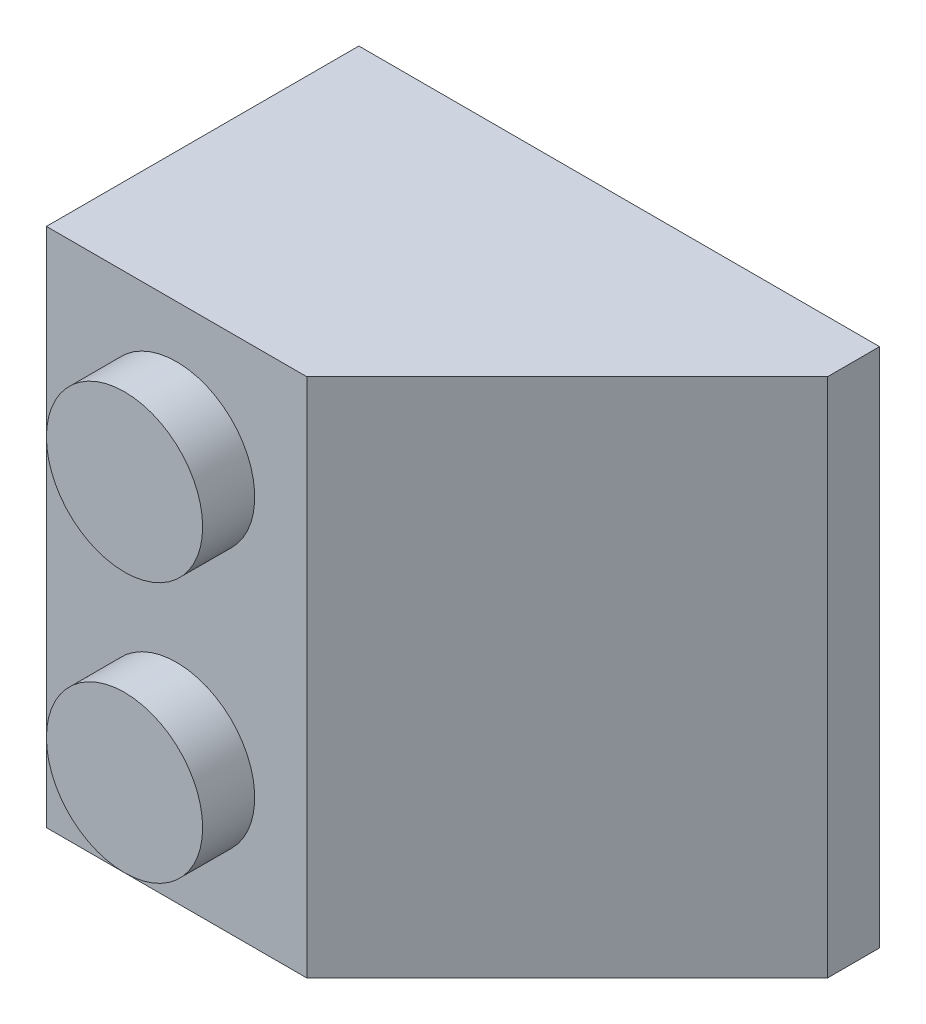
ISO-10303-21;
HEADER;
FILE_DESCRIPTION(('STEP AP214'),'2;1');
FILE_NAME('part.step','',(''),(''),'','','');
FILE_SCHEMA(('AUTOMOTIVE_DESIGN { 1 0 10303 214 1 1 1 1 }'));
ENDSEC;
DATA;
#1=APPLICATION_CONTEXT('core data for automotive mechanical design processes');
#2=APPLICATION_PROTOCOL_DEFINITION('international standard','automotive_design',2000,#1);
#3=PRODUCT_CONTEXT('',#1,'mechanical');
#4=PRODUCT('Part','Part','',(#3));
#5=PRODUCT_RELATED_PRODUCT_CATEGORY('part','',(#4));
#6=PRODUCT_DEFINITION_FORMATION('','',#4);
#7=PRODUCT_DEFINITION_CONTEXT('part definition',#1,'design');
#8=PRODUCT_DEFINITION('design','',#6,#7);
#9=PRODUCT_DEFINITION_SHAPE('','',#8);
#10=(LENGTH_UNIT() NAMED_UNIT(*) SI_UNIT(.MILLI.,.METRE.));
#11=(NAMED_UNIT(*) PLANE_ANGLE_UNIT() SI_UNIT($,.RADIAN.));
#12=(NAMED_UNIT(*) SI_UNIT($,.STERADIAN.) SOLID_ANGLE_UNIT());
#13=UNCERTAINTY_MEASURE_WITH_UNIT(LENGTH_MEASURE(1.E-05),#10,'distance_accuracy_value','');
#14=(GEOMETRIC_REPRESENTATION_CONTEXT(3) GLOBAL_UNCERTAINTY_ASSIGNED_CONTEXT((#13)) GLOBAL_UNIT_ASSIGNED_CONTEXT((#10,
#11,#12)) REPRESENTATION_CONTEXT('',''));
#15=CARTESIAN_POINT('',(0.,0.,0.));
#16=DIRECTION('',(0.,0.,1.));
#17=DIRECTION('',(1.,0.,0.));
#18=AXIS2_PLACEMENT_3D('',#15,#16,#17);
#19=CARTESIAN_POINT('',(0.,0.,0.));
#20=DIRECTION('',(0.,0.,-1.));
#21=DIRECTION('',(-1.,0.,0.));
#22=AXIS2_PLACEMENT_3D('',#19,#20,#21);
#23=PLANE('',#22);
#24=DIRECTION('',(0.,-1.,0.));
#25=VECTOR('',#24,1.);
#26=CARTESIAN_POINT('',(0.,0.,0.));
#27=LINE('',#26,#25);
#28=CARTESIAN_POINT('',(0.,16.,0.));
#29=VERTEX_POINT('',#28);
#30=CARTESIAN_POINT('',(0.,0.,0.));
#31=VERTEX_POINT('',#30);
#32=EDGE_CURVE('E207',#29,#31,#27,.T.);
#33=ORIENTED_EDGE('',*,*,#32,.F.);
#34=DIRECTION('',(-1.,0.,0.));
#35=VECTOR('',#34,1.);
#36=CARTESIAN_POINT('',(0.,16.,0.));
#37=LINE('',#36,#35);
#38=CARTESIAN_POINT('',(16.,16.,0.));
#39=VERTEX_POINT('',#38);
#40=EDGE_CURVE('E213',#39,#29,#37,.T.);
#41=ORIENTED_EDGE('',*,*,#40,.F.);
#42=DIRECTION('',(0.,1.,0.));
#43=VECTOR('',#42,1.);
#44=CARTESIAN_POINT('',(16.,0.,0.));
#45=LINE('',#44,#43);
#46=CARTESIAN_POINT('',(16.,0.,0.));
#47=VERTEX_POINT('',#46);
#48=EDGE_CURVE('E224',#47,#39,#45,.T.);
#49=ORIENTED_EDGE('',*,*,#48,.F.);
#50=DIRECTION('',(1.,0.,0.));
#51=VECTOR('',#50,1.);
#52=CARTESIAN_POINT('',(0.,0.,0.));
#53=LINE('',#52,#51);
#54=EDGE_CURVE('E221',#31,#47,#53,.T.);
#55=ORIENTED_EDGE('',*,*,#54,.F.);
#56=EDGE_LOOP('',(#33,#41,#49,#55));
#57=FACE_BOUND('',#56,.T.);
#58=DIRECTION('',(-1.,0.,0.));
#59=VECTOR('',#58,1.);
#60=CARTESIAN_POINT('',(0.,14.4,0.));
#61=LINE('',#60,#59);
#62=CARTESIAN_POINT('',(14.4,14.4,0.));
#63=VERTEX_POINT('',#62);
#64=CARTESIAN_POINT('',(1.6,14.4,0.));
#65=VERTEX_POINT('',#64);
#66=EDGE_CURVE('E154',#63,#65,#61,.T.);
#67=ORIENTED_EDGE('',*,*,#66,.T.);
#68=DIRECTION('',(0.,-1.,0.));
#69=VECTOR('',#68,1.);
#70=CARTESIAN_POINT('',(1.6,0.,0.));
#71=LINE('',#70,#69);
#72=CARTESIAN_POINT('',(1.6,1.6,0.));
#73=VERTEX_POINT('',#72);
#74=EDGE_CURVE('E174',#65,#73,#71,.T.);
#75=ORIENTED_EDGE('',*,*,#74,.T.);
#76=DIRECTION('',(1.,0.,0.));
#77=VECTOR('',#76,1.);
#78=CARTESIAN_POINT('',(0.,1.6,0.));
#79=LINE('',#78,#77);
#80=CARTESIAN_POINT('',(14.4,1.6,0.));
#81=VERTEX_POINT('',#80);
#82=EDGE_CURVE('E185',#73,#81,#79,.T.);
#83=ORIENTED_EDGE('',*,*,#82,.T.);
#84=DIRECTION('',(0.,1.,0.));
#85=VECTOR('',#84,1.);
#86=CARTESIAN_POINT('',(14.4,0.,0.));
#87=LINE('',#86,#85);
#88=EDGE_CURVE('E188',#81,#63,#87,.T.);
#89=ORIENTED_EDGE('',*,*,#88,.T.);
#90=EDGE_LOOP('',(#67,#75,#83,#89));
#91=FACE_BOUND('',#90,.T.);
#92=ADVANCED_FACE('F39',(#57,#91),#23,.T.);
#93=CARTESIAN_POINT('',(0.,0.,9.6));
#94=DIRECTION('',(0.,0.,-1.));
#95=DIRECTION('',(-1.,0.,0.));
#96=AXIS2_PLACEMENT_3D('',#93,#94,#95);
#97=PLANE('',#96);
#98=CARTESIAN_POINT('',(4.,4.,9.6));
#99=DIRECTION('',(0.,0.,-1.));
#100=DIRECTION('',(-1.,0.,0.));
#101=AXIS2_PLACEMENT_3D('',#98,#99,#100);
#102=CIRCLE('',#101,2.4);
#103=CARTESIAN_POINT('',(1.6,4.,9.6));
#104=VERTEX_POINT('',#103);
#105=EDGE_CURVE('E47',#104,#104,#102,.F.);
#106=ORIENTED_EDGE('',*,*,#105,.F.);
#107=EDGE_LOOP('',(#106));
#108=FACE_BOUND('',#107,.T.);
#109=DIRECTION('',(1.,0.,0.));
#110=VECTOR('',#109,1.);
#111=CARTESIAN_POINT('',(0.,0.,9.6));
#112=LINE('',#111,#110);
#113=CARTESIAN_POINT('',(0.,0.,9.6));
#114=VERTEX_POINT('',#113);
#115=CARTESIAN_POINT('',(8.,0.,9.6));
#116=VERTEX_POINT('',#115);
#117=EDGE_CURVE('E212',#114,#116,#112,.T.);
#118=ORIENTED_EDGE('',*,*,#117,.T.);
#119=DIRECTION('',(0.,-1.,0.));
#120=VECTOR('',#119,1.);
#121=CARTESIAN_POINT('',(8.,16.,9.6));
#122=LINE('',#121,#120);
#123=CARTESIAN_POINT('',(8.,16.,9.6));
#124=VERTEX_POINT('',#123);
#125=EDGE_CURVE('E202',#124,#116,#122,.T.);
#126=ORIENTED_EDGE('',*,*,#125,.F.);
#127=DIRECTION('',(-1.,0.,0.));
#128=VECTOR('',#127,1.);
#129=CARTESIAN_POINT('',(0.,16.,9.6));
#130=LINE('',#129,#128);
#131=CARTESIAN_POINT('',(0.,16.,9.6));
#132=VERTEX_POINT('',#131);
#133=EDGE_CURVE('E216',#124,#132,#130,.T.);
#134=ORIENTED_EDGE('',*,*,#133,.T.);
#135=DIRECTION('',(0.,-1.,0.));
#136=VECTOR('',#135,1.);
#137=CARTESIAN_POINT('',(0.,0.,9.6));
#138=LINE('',#137,#136);
#139=EDGE_CURVE('E209',#132,#114,#138,.T.);
#140=ORIENTED_EDGE('',*,*,#139,.T.);
#141=EDGE_LOOP('',(#118,#126,#134,#140));
#142=FACE_BOUND('',#141,.T.);
#143=CARTESIAN_POINT('',(4.,12.,9.6));
#144=DIRECTION('',(0.,0.,-1.));
#145=DIRECTION('',(-1.,0.,0.));
#146=AXIS2_PLACEMENT_3D('',#143,#144,#145);
#147=CIRCLE('',#146,2.4);
#148=CARTESIAN_POINT('',(1.6,12.,9.6));
#149=VERTEX_POINT('',#148);
#150=EDGE_CURVE('E12',#149,#149,#147,.F.);
#151=ORIENTED_EDGE('',*,*,#150,.F.);
#152=EDGE_LOOP('',(#151));
#153=FACE_BOUND('',#152,.T.);
#154=ADVANCED_FACE('F241',(#108,#142,#153),#97,.F.);
#155=CARTESIAN_POINT('',(0.,0.,9.6));
#156=DIRECTION('',(1.,0.,0.));
#157=DIRECTION('',(0.,0.,-1.));
#158=AXIS2_PLACEMENT_3D('',#155,#156,#157);
#159=PLANE('',#158);
#160=ORIENTED_EDGE('',*,*,#32,.T.);
#161=DIRECTION('',(0.,0.,-1.));
#162=VECTOR('',#161,1.);
#163=CARTESIAN_POINT('',(0.,0.,9.6));
#164=LINE('',#163,#162);
#165=EDGE_CURVE('E234',#114,#31,#164,.T.);
#166=ORIENTED_EDGE('',*,*,#165,.F.);
#167=ORIENTED_EDGE('',*,*,#139,.F.);
#168=DIRECTION('',(0.,0.,-1.));
#169=VECTOR('',#168,1.);
#170=CARTESIAN_POINT('',(0.,16.,9.6));
#171=LINE('',#170,#169);
#172=EDGE_CURVE('E218',#132,#29,#171,.T.);
#173=ORIENTED_EDGE('',*,*,#172,.T.);
#174=EDGE_LOOP('',(#160,#166,#167,#173));
#175=FACE_BOUND('',#174,.T.);
#176=ADVANCED_FACE('F41',(#175),#159,.F.);
#177=CARTESIAN_POINT('',(0.,0.,9.6));
#178=DIRECTION('',(0.,1.,0.));
#179=DIRECTION('',(0.,0.,1.));
#180=AXIS2_PLACEMENT_3D('',#177,#178,#179);
#181=PLANE('',#180);
#182=DIRECTION('',(0.,0.,-1.));
#183=VECTOR('',#182,1.);
#184=CARTESIAN_POINT('',(16.,0.,9.6));
#185=LINE('',#184,#183);
#186=CARTESIAN_POINT('',(16.,0.,1.6));
#187=VERTEX_POINT('',#186);
#188=EDGE_CURVE('E232',#187,#47,#185,.T.);
#189=ORIENTED_EDGE('',*,*,#188,.F.);
#190=DIRECTION('',(0.707106781186548,0.,-0.707106781186548));
#191=VECTOR('',#190,1.);
#192=CARTESIAN_POINT('',(8.8,0.,8.8));
#193=LINE('',#192,#191);
#194=EDGE_CURVE('E198',#116,#187,#193,.T.);
#195=ORIENTED_EDGE('',*,*,#194,.F.);
#196=ORIENTED_EDGE('',*,*,#117,.F.);
#197=ORIENTED_EDGE('',*,*,#165,.T.);
#198=ORIENTED_EDGE('',*,*,#54,.T.);
#199=EDGE_LOOP('',(#189,#195,#196,#197,#198));
#200=FACE_BOUND('',#199,.T.);
#201=ADVANCED_FACE('F281',(#200),#181,.F.);
#202=CARTESIAN_POINT('',(16.,0.,9.6));
#203=DIRECTION('',(-1.,0.,0.));
#204=DIRECTION('',(0.,0.,1.));
#205=AXIS2_PLACEMENT_3D('',#202,#203,#204);
#206=PLANE('',#205);
#207=DIRECTION('',(0.,0.,-1.));
#208=VECTOR('',#207,1.);
#209=CARTESIAN_POINT('',(16.,16.,9.6));
#210=LINE('',#209,#208);
#211=CARTESIAN_POINT('',(16.,16.,1.6));
#212=VERTEX_POINT('',#211);
#213=EDGE_CURVE('E230',#212,#39,#210,.T.);
#214=ORIENTED_EDGE('',*,*,#213,.F.);
#215=DIRECTION('',(0.,-1.,0.));
#216=VECTOR('',#215,1.);
#217=CARTESIAN_POINT('',(16.,16.,1.6));
#218=LINE('',#217,#216);
#219=EDGE_CURVE('E204',#212,#187,#218,.T.);
#220=ORIENTED_EDGE('',*,*,#219,.T.);
#221=ORIENTED_EDGE('',*,*,#188,.T.);
#222=ORIENTED_EDGE('',*,*,#48,.T.);
#223=EDGE_LOOP('',(#214,#220,#221,#222));
#224=FACE_BOUND('',#223,.T.);
#225=ADVANCED_FACE('F278',(#224),#206,.F.);
#226=CARTESIAN_POINT('',(0.,16.,9.6));
#227=DIRECTION('',(0.,-1.,0.));
#228=DIRECTION('',(1.,0.,0.));
#229=AXIS2_PLACEMENT_3D('',#226,#227,#228);
#230=PLANE('',#229);
#231=ORIENTED_EDGE('',*,*,#133,.F.);
#232=DIRECTION('',(0.707106781186548,0.,-0.707106781186548));
#233=VECTOR('',#232,1.);
#234=CARTESIAN_POINT('',(8.8,16.,8.8));
#235=LINE('',#234,#233);
#236=EDGE_CURVE('E199',#124,#212,#235,.T.);
#237=ORIENTED_EDGE('',*,*,#236,.T.);
#238=ORIENTED_EDGE('',*,*,#213,.T.);
#239=ORIENTED_EDGE('',*,*,#40,.T.);
#240=ORIENTED_EDGE('',*,*,#172,.F.);
#241=EDGE_LOOP('',(#231,#237,#238,#239,#240));
#242=FACE_BOUND('',#241,.T.);
#243=ADVANCED_FACE('F274',(#242),#230,.F.);
#244=CARTESIAN_POINT('',(8.8,16.,8.8));
#245=DIRECTION('',(-0.707106781186548,0.,-0.707106781186548));
#246=DIRECTION('',(-0.707106781186548,0.,0.707106781186548));
#247=AXIS2_PLACEMENT_3D('',#244,#245,#246);
#248=PLANE('',#247);
#249=ORIENTED_EDGE('',*,*,#194,.T.);
#250=ORIENTED_EDGE('',*,*,#219,.F.);
#251=ORIENTED_EDGE('',*,*,#236,.F.);
#252=ORIENTED_EDGE('',*,*,#125,.T.);
#253=EDGE_LOOP('',(#249,#250,#251,#252));
#254=FACE_BOUND('',#253,.T.);
#255=ADVANCED_FACE('F277',(#254),#248,.F.);
#256=CARTESIAN_POINT('',(4.,4.,11.2));
#257=DIRECTION('',(0.,0.,-1.));
#258=DIRECTION('',(-1.,0.,0.));
#259=AXIS2_PLACEMENT_3D('',#256,#257,#258);
#260=CYLINDRICAL_SURFACE('',#259,2.4);
#261=CARTESIAN_POINT('',(4.,4.,11.2));
#262=DIRECTION('',(0.,0.,1.));
#263=DIRECTION('',(1.,0.,0.));
#264=AXIS2_PLACEMENT_3D('',#261,#262,#263);
#265=CIRCLE('',#264,2.4);
#266=CARTESIAN_POINT('',(6.4,4.,11.2));
#267=VERTEX_POINT('',#266);
#268=EDGE_CURVE('E195',#267,#267,#265,.T.);
#269=ORIENTED_EDGE('',*,*,#268,.F.);
#270=EDGE_LOOP('',(#269));
#271=FACE_BOUND('',#270,.T.);
#272=ORIENTED_EDGE('',*,*,#105,.T.);
#273=EDGE_LOOP('',(#272));
#274=FACE_BOUND('',#273,.T.);
#275=ADVANCED_FACE('F239',(#271,#274),#260,.T.);
#276=CARTESIAN_POINT('',(4.,4.,11.2));
#277=DIRECTION('',(0.,0.,1.));
#278=DIRECTION('',(1.,0.,0.));
#279=AXIS2_PLACEMENT_3D('',#276,#277,#278);
#280=PLANE('',#279);
#281=ORIENTED_EDGE('',*,*,#268,.T.);
#282=EDGE_LOOP('',(#281));
#283=FACE_BOUND('',#282,.T.);
#284=ADVANCED_FACE('F252',(#283),#280,.T.);
#285=CARTESIAN_POINT('',(4.,12.,11.2));
#286=DIRECTION('',(0.,0.,-1.));
#287=DIRECTION('',(-1.,0.,0.));
#288=AXIS2_PLACEMENT_3D('',#285,#286,#287);
#289=CYLINDRICAL_SURFACE('',#288,2.4);
#290=CARTESIAN_POINT('',(4.,12.,11.2));
#291=DIRECTION('',(0.,0.,1.));
#292=DIRECTION('',(1.,0.,0.));
#293=AXIS2_PLACEMENT_3D('',#290,#291,#292);
#294=CIRCLE('',#293,2.4);
#295=CARTESIAN_POINT('',(6.4,12.,11.2));
#296=VERTEX_POINT('',#295);
#297=EDGE_CURVE('E158',#296,#296,#294,.T.);
#298=ORIENTED_EDGE('',*,*,#297,.F.);
#299=EDGE_LOOP('',(#298));
#300=FACE_BOUND('',#299,.T.);
#301=ORIENTED_EDGE('',*,*,#150,.T.);
#302=EDGE_LOOP('',(#301));
#303=FACE_BOUND('',#302,.T.);
#304=ADVANCED_FACE('F249',(#300,#303),#289,.T.);
#305=CARTESIAN_POINT('',(4.,12.,11.2));
#306=DIRECTION('',(0.,0.,1.));
#307=DIRECTION('',(1.,0.,0.));
#308=AXIS2_PLACEMENT_3D('',#305,#306,#307);
#309=PLANE('',#308);
#310=ORIENTED_EDGE('',*,*,#297,.T.);
#311=EDGE_LOOP('',(#310));
#312=FACE_BOUND('',#311,.T.);
#313=ADVANCED_FACE('F251',(#312),#309,.T.);
#314=CARTESIAN_POINT('',(0.,0.,8.));
#315=DIRECTION('',(0.,0.,-1.));
#316=DIRECTION('',(-1.,0.,0.));
#317=AXIS2_PLACEMENT_3D('',#314,#315,#316);
#318=PLANE('',#317);
#319=CARTESIAN_POINT('',(8.,8.,7.99999999998136));
#320=DIRECTION('',(0.,0.,-1.));
#321=DIRECTION('',(-1.,0.,0.));
#322=AXIS2_PLACEMENT_3D('',#319,#320,#321);
#323=CIRCLE('',#322,3.256);
#324=CARTESIAN_POINT('',(7.33725830020305,11.1878377372988,8.));
#325=VERTEX_POINT('',#324);
#326=CARTESIAN_POINT('',(7.33725830020305,4.81216226270059,7.99999999998136));
#327=VERTEX_POINT('',#326);
#328=EDGE_CURVE('E182',#325,#327,#323,.F.);
#329=ORIENTED_EDGE('',*,*,#328,.T.);
#330=DIRECTION('',(0.,-1.,0.));
#331=VECTOR('',#330,1.);
#332=CARTESIAN_POINT('',(7.33725830020305,16.,8.));
#333=LINE('',#332,#331);
#334=CARTESIAN_POINT('',(7.33725830020305,1.6,8.));
#335=VERTEX_POINT('',#334);
#336=EDGE_CURVE('E140',#327,#335,#333,.T.);
#337=ORIENTED_EDGE('',*,*,#336,.T.);
#338=DIRECTION('',(1.,0.,0.));
#339=VECTOR('',#338,1.);
#340=CARTESIAN_POINT('',(0.,1.6,8.));
#341=LINE('',#340,#339);
#342=CARTESIAN_POINT('',(1.6,1.6,8.));
#343=VERTEX_POINT('',#342);
#344=EDGE_CURVE('E146',#343,#335,#341,.T.);
#345=ORIENTED_EDGE('',*,*,#344,.F.);
#346=DIRECTION('',(0.,-1.,0.));
#347=VECTOR('',#346,1.);
#348=CARTESIAN_POINT('',(1.6,0.,8.));
#349=LINE('',#348,#347);
#350=CARTESIAN_POINT('',(1.6,14.4,8.));
#351=VERTEX_POINT('',#350);
#352=EDGE_CURVE('E151',#351,#343,#349,.T.);
#353=ORIENTED_EDGE('',*,*,#352,.F.);
#354=DIRECTION('',(-1.,0.,0.));
#355=VECTOR('',#354,1.);
#356=CARTESIAN_POINT('',(0.,14.4,8.));
#357=LINE('',#356,#355);
#358=CARTESIAN_POINT('',(7.33725830020305,14.4,8.));
#359=VERTEX_POINT('',#358);
#360=EDGE_CURVE('E148',#359,#351,#357,.T.);
#361=ORIENTED_EDGE('',*,*,#360,.F.);
#362=EDGE_CURVE('E139',#359,#325,#333,.T.);
#363=ORIENTED_EDGE('',*,*,#362,.T.);
#364=EDGE_LOOP('',(#329,#337,#345,#353,#361,#363));
#365=FACE_BOUND('',#364,.T.);
#366=CARTESIAN_POINT('',(4.,4.,8.));
#367=DIRECTION('',(0.,0.,-1.));
#368=DIRECTION('',(-1.,0.,0.));
#369=AXIS2_PLACEMENT_3D('',#366,#367,#368);
#370=CIRCLE('',#369,0.800000000000001);
#371=CARTESIAN_POINT('',(3.2,4.,8.));
#372=VERTEX_POINT('',#371);
#373=EDGE_CURVE('E159',#372,#372,#370,.F.);
#374=ORIENTED_EDGE('',*,*,#373,.T.);
#375=EDGE_LOOP('',(#374));
#376=FACE_BOUND('',#375,.T.);
#377=CARTESIAN_POINT('',(4.,12.,8.));
#378=DIRECTION('',(0.,0.,-1.));
#379=DIRECTION('',(-1.,0.,0.));
#380=AXIS2_PLACEMENT_3D('',#377,#378,#379);
#381=CIRCLE('',#380,0.800000000000001);
#382=CARTESIAN_POINT('',(3.2,12.,8.));
#383=VERTEX_POINT('',#382);
#384=EDGE_CURVE('E155',#383,#383,#381,.F.);
#385=ORIENTED_EDGE('',*,*,#384,.T.);
#386=EDGE_LOOP('',(#385));
#387=FACE_BOUND('',#386,.T.);
#388=ADVANCED_FACE('F259',(#365,#376,#387),#318,.T.);
#389=CARTESIAN_POINT('',(1.6,0.,9.6));
#390=DIRECTION('',(1.,0.,0.));
#391=DIRECTION('',(0.,0.,-1.));
#392=AXIS2_PLACEMENT_3D('',#389,#390,#391);
#393=PLANE('',#392);
#394=ORIENTED_EDGE('',*,*,#74,.F.);
#395=DIRECTION('',(0.,0.,-1.));
#396=VECTOR('',#395,1.);
#397=CARTESIAN_POINT('',(1.6,14.4,9.6));
#398=LINE('',#397,#396);
#399=EDGE_CURVE('E150',#351,#65,#398,.T.);
#400=ORIENTED_EDGE('',*,*,#399,.F.);
#401=ORIENTED_EDGE('',*,*,#352,.T.);
#402=DIRECTION('',(0.,0.,-1.));
#403=VECTOR('',#402,1.);
#404=CARTESIAN_POINT('',(1.6,1.6,9.6));
#405=LINE('',#404,#403);
#406=EDGE_CURVE('E160',#343,#73,#405,.T.);
#407=ORIENTED_EDGE('',*,*,#406,.T.);
#408=EDGE_LOOP('',(#394,#400,#401,#407));
#409=FACE_BOUND('',#408,.T.);
#410=ADVANCED_FACE('F339',(#409),#393,.T.);
#411=CARTESIAN_POINT('',(0.,1.6,9.6));
#412=DIRECTION('',(0.,1.,0.));
#413=DIRECTION('',(0.,0.,1.));
#414=AXIS2_PLACEMENT_3D('',#411,#412,#413);
#415=PLANE('',#414);
#416=DIRECTION('',(0.,0.,-1.));
#417=VECTOR('',#416,1.);
#418=CARTESIAN_POINT('',(14.4,1.6,9.6));
#419=LINE('',#418,#417);
#420=CARTESIAN_POINT('',(14.4,1.6,0.93725830020305));
#421=VERTEX_POINT('',#420);
#422=EDGE_CURVE('E163',#421,#81,#419,.T.);
#423=ORIENTED_EDGE('',*,*,#422,.T.);
#424=ORIENTED_EDGE('',*,*,#82,.F.);
#425=ORIENTED_EDGE('',*,*,#406,.F.);
#426=ORIENTED_EDGE('',*,*,#344,.T.);
#427=DIRECTION('',(0.707106781186548,0.,-0.707106781186548));
#428=VECTOR('',#427,1.);
#429=CARTESIAN_POINT('',(7.66862915010153,1.6,7.66862915010153));
#430=LINE('',#429,#428);
#431=EDGE_CURVE('E168',#335,#421,#430,.T.);
#432=ORIENTED_EDGE('',*,*,#431,.T.);
#433=EDGE_LOOP('',(#423,#424,#425,#426,#432));
#434=FACE_BOUND('',#433,.T.);
#435=ADVANCED_FACE('F344',(#434),#415,.T.);
#436=CARTESIAN_POINT('',(14.4,0.,9.6));
#437=DIRECTION('',(-1.,0.,0.));
#438=DIRECTION('',(0.,0.,1.));
#439=AXIS2_PLACEMENT_3D('',#436,#437,#438);
#440=PLANE('',#439);
#441=DIRECTION('',(0.,0.,-1.));
#442=VECTOR('',#441,1.);
#443=CARTESIAN_POINT('',(14.4,14.4,9.6));
#444=LINE('',#443,#442);
#445=CARTESIAN_POINT('',(14.4,14.4,0.93725830020305));
#446=VERTEX_POINT('',#445);
#447=EDGE_CURVE('E165',#446,#63,#444,.T.);
#448=ORIENTED_EDGE('',*,*,#447,.T.);
#449=ORIENTED_EDGE('',*,*,#88,.F.);
#450=ORIENTED_EDGE('',*,*,#422,.F.);
#451=DIRECTION('',(0.,-1.,0.));
#452=VECTOR('',#451,1.);
#453=CARTESIAN_POINT('',(14.4,0.,0.93725830020305));
#454=LINE('',#453,#452);
#455=EDGE_CURVE('E142',#446,#421,#454,.T.);
#456=ORIENTED_EDGE('',*,*,#455,.F.);
#457=EDGE_LOOP('',(#448,#449,#450,#456));
#458=FACE_BOUND('',#457,.T.);
#459=ADVANCED_FACE('F354',(#458),#440,.T.);
#460=CARTESIAN_POINT('',(0.,14.4,9.6));
#461=DIRECTION('',(0.,-1.,0.));
#462=DIRECTION('',(1.,0.,0.));
#463=AXIS2_PLACEMENT_3D('',#460,#461,#462);
#464=PLANE('',#463);
#465=ORIENTED_EDGE('',*,*,#360,.T.);
#466=ORIENTED_EDGE('',*,*,#399,.T.);
#467=ORIENTED_EDGE('',*,*,#66,.F.);
#468=ORIENTED_EDGE('',*,*,#447,.F.);
#469=DIRECTION('',(0.707106781186548,0.,-0.707106781186548));
#470=VECTOR('',#469,1.);
#471=CARTESIAN_POINT('',(2.86862915010152,14.4,12.4686291501015));
#472=LINE('',#471,#470);
#473=EDGE_CURVE('E143',#359,#446,#472,.T.);
#474=ORIENTED_EDGE('',*,*,#473,.F.);
#475=EDGE_LOOP('',(#465,#466,#467,#468,#474));
#476=FACE_BOUND('',#475,.T.);
#477=ADVANCED_FACE('F364',(#476),#464,.T.);
#478=CARTESIAN_POINT('',(7.66862915010153,16.,7.66862915010153));
#479=DIRECTION('',(-0.707106781186548,0.,-0.707106781186548));
#480=DIRECTION('',(-0.707106781186548,0.,0.707106781186548));
#481=AXIS2_PLACEMENT_3D('',#478,#479,#480);
#482=PLANE('',#481);
#483=CARTESIAN_POINT('',(8.,8.,7.33725830019694));
#484=DIRECTION('',(-0.707106781186548,0.,-0.707106781186548));
#485=DIRECTION('',(0.707106781186548,0.,-0.707106781186548));
#486=AXIS2_PLACEMENT_3D('',#483,#484,#485);
#487=ELLIPSE('',#486,4.6046793590868,3.256);
#488=EDGE_CURVE('E61',#327,#325,#487,.F.);
#489=ORIENTED_EDGE('',*,*,#488,.T.);
#490=ORIENTED_EDGE('',*,*,#362,.F.);
#491=ORIENTED_EDGE('',*,*,#473,.T.);
#492=ORIENTED_EDGE('',*,*,#455,.T.);
#493=ORIENTED_EDGE('',*,*,#431,.F.);
#494=ORIENTED_EDGE('',*,*,#336,.F.);
#495=EDGE_LOOP('',(#489,#490,#491,#492,#493,#494));
#496=FACE_BOUND('',#495,.T.);
#497=ADVANCED_FACE('F374',(#496),#482,.T.);
#498=CARTESIAN_POINT('',(4.,4.,11.2));
#499=DIRECTION('',(0.,0.,-1.));
#500=DIRECTION('',(-1.,0.,0.));
#501=AXIS2_PLACEMENT_3D('',#498,#499,#500);
#502=CYLINDRICAL_SURFACE('',#501,0.800000000000001);
#503=CARTESIAN_POINT('',(4.,4.,9.6));
#504=DIRECTION('',(0.,0.,1.));
#505=DIRECTION('',(1.,0.,0.));
#506=AXIS2_PLACEMENT_3D('',#503,#504,#505);
#507=CIRCLE('',#506,0.800000000000001);
#508=CARTESIAN_POINT('',(4.8,4.,9.6));
#509=VERTEX_POINT('',#508);
#510=EDGE_CURVE('E170',#509,#509,#507,.T.);
#511=ORIENTED_EDGE('',*,*,#510,.T.);
#512=EDGE_LOOP('',(#511));
#513=FACE_BOUND('',#512,.T.);
#514=ORIENTED_EDGE('',*,*,#373,.F.);
#515=EDGE_LOOP('',(#514));
#516=FACE_BOUND('',#515,.T.);
#517=ADVANCED_FACE('F382',(#513,#516),#502,.F.);
#518=CARTESIAN_POINT('',(4.,4.,9.6));
#519=DIRECTION('',(0.,0.,1.));
#520=DIRECTION('',(1.,0.,0.));
#521=AXIS2_PLACEMENT_3D('',#518,#519,#520);
#522=PLANE('',#521);
#523=ORIENTED_EDGE('',*,*,#510,.F.);
#524=EDGE_LOOP('',(#523));
#525=FACE_BOUND('',#524,.T.);
#526=ADVANCED_FACE('F387',(#525),#522,.F.);
#527=CARTESIAN_POINT('',(4.,12.,11.2));
#528=DIRECTION('',(0.,0.,-1.));
#529=DIRECTION('',(-1.,0.,0.));
#530=AXIS2_PLACEMENT_3D('',#527,#528,#529);
#531=CYLINDRICAL_SURFACE('',#530,0.800000000000001);
#532=CARTESIAN_POINT('',(4.,12.,9.6));
#533=DIRECTION('',(0.,0.,1.));
#534=DIRECTION('',(1.,0.,0.));
#535=AXIS2_PLACEMENT_3D('',#532,#533,#534);
#536=CIRCLE('',#535,0.800000000000001);
#537=CARTESIAN_POINT('',(4.8,12.,9.6));
#538=VERTEX_POINT('',#537);
#539=EDGE_CURVE('E179',#538,#538,#536,.T.);
#540=ORIENTED_EDGE('',*,*,#539,.T.);
#541=EDGE_LOOP('',(#540));
#542=FACE_BOUND('',#541,.T.);
#543=ORIENTED_EDGE('',*,*,#384,.F.);
#544=EDGE_LOOP('',(#543));
#545=FACE_BOUND('',#544,.T.);
#546=ADVANCED_FACE('F397',(#542,#545),#531,.F.);
#547=CARTESIAN_POINT('',(4.,12.,9.6));
#548=DIRECTION('',(0.,0.,1.));
#549=DIRECTION('',(1.,0.,0.));
#550=AXIS2_PLACEMENT_3D('',#547,#548,#549);
#551=PLANE('',#550);
#552=ORIENTED_EDGE('',*,*,#539,.F.);
#553=EDGE_LOOP('',(#552));
#554=FACE_BOUND('',#553,.T.);
#555=ADVANCED_FACE('F407',(#554),#551,.F.);
#556=CARTESIAN_POINT('',(8.,8.,0.));
#557=DIRECTION('',(0.,0.,-1.));
#558=DIRECTION('',(-1.,0.,0.));
#559=AXIS2_PLACEMENT_3D('',#556,#557,#558);
#560=PLANE('',#559);
#561=CARTESIAN_POINT('',(8.,8.,0.));
#562=DIRECTION('',(0.,0.,-1.));
#563=DIRECTION('',(-1.,0.,0.));
#564=AXIS2_PLACEMENT_3D('',#561,#562,#563);
#565=CIRCLE('',#564,2.4);
#566=CARTESIAN_POINT('',(5.6,8.,0.));
#567=VERTEX_POINT('',#566);
#568=EDGE_CURVE('E136',#567,#567,#565,.T.);
#569=ORIENTED_EDGE('',*,*,#568,.F.);
#570=EDGE_LOOP('',(#569));
#571=FACE_BOUND('',#570,.T.);
#572=CARTESIAN_POINT('',(8.,8.,0.));
#573=DIRECTION('',(0.,0.,-1.));
#574=DIRECTION('',(-1.,0.,0.));
#575=AXIS2_PLACEMENT_3D('',#572,#573,#574);
#576=CIRCLE('',#575,3.256);
#577=CARTESIAN_POINT('',(4.744,8.,0.));
#578=VERTEX_POINT('',#577);
#579=EDGE_CURVE('E480',#578,#578,#576,.T.);
#580=ORIENTED_EDGE('',*,*,#579,.T.);
#581=EDGE_LOOP('',(#580));
#582=FACE_BOUND('',#581,.T.);
#583=ADVANCED_FACE('F417',(#571,#582),#560,.T.);
#584=CARTESIAN_POINT('',(8.,8.,500000.));
#585=DIRECTION('',(0.,0.,-1.));
#586=DIRECTION('',(-1.,0.,0.));
#587=AXIS2_PLACEMENT_3D('',#584,#585,#586);
#588=CYLINDRICAL_SURFACE('',#587,3.256);
#589=ORIENTED_EDGE('',*,*,#488,.F.);
#590=ORIENTED_EDGE('',*,*,#328,.F.);
#591=EDGE_LOOP('',(#589,#590));
#592=FACE_BOUND('',#591,.T.);
#593=ORIENTED_EDGE('',*,*,#579,.F.);
#594=EDGE_LOOP('',(#593));
#595=FACE_BOUND('',#594,.T.);
#596=ADVANCED_FACE('F441',(#592,#595),#588,.T.);
#597=CARTESIAN_POINT('',(8.,8.,500000.));
#598=DIRECTION('',(0.,0.,-1.));
#599=DIRECTION('',(-1.,0.,0.));
#600=AXIS2_PLACEMENT_3D('',#597,#598,#599);
#601=CYLINDRICAL_SURFACE('',#600,2.4);
#602=CARTESIAN_POINT('',(8.,8.,7.99999999998136));
#603=DIRECTION('',(0.,0.,-1.));
#604=DIRECTION('',(-1.,0.,0.));
#605=AXIS2_PLACEMENT_3D('',#602,#603,#604);
#606=CIRCLE('',#605,2.4);
#607=CARTESIAN_POINT('',(7.33725830020305,10.3066801770836,7.99999999998136));
#608=VERTEX_POINT('',#607);
#609=CARTESIAN_POINT('',(7.33725830020305,5.69331982291732,8.));
#610=VERTEX_POINT('',#609);
#611=EDGE_CURVE('E53',#608,#610,#606,.F.);
#612=ORIENTED_EDGE('',*,*,#611,.T.);
#613=CARTESIAN_POINT('',(8.,8.,7.33725830019694));
#614=DIRECTION('',(-0.707106781186548,0.,-0.707106781186548));
#615=DIRECTION('',(0.707106781186548,0.,-0.707106781186548));
#616=AXIS2_PLACEMENT_3D('',#613,#614,#615);
#617=ELLIPSE('',#616,3.39411254969543,2.4);
#618=EDGE_CURVE('E126',#610,#608,#617,.F.);
#619=ORIENTED_EDGE('',*,*,#618,.T.);
#620=EDGE_LOOP('',(#612,#619));
#621=FACE_BOUND('',#620,.T.);
#622=ORIENTED_EDGE('',*,*,#568,.T.);
#623=EDGE_LOOP('',(#622));
#624=FACE_BOUND('',#623,.T.);
#625=ADVANCED_FACE('F127',(#621,#624),#601,.F.);
#626=EDGE_CURVE('E135',#608,#610,#333,.T.);
#627=ORIENTED_EDGE('',*,*,#626,.F.);
#628=ORIENTED_EDGE('',*,*,#618,.F.);
#629=EDGE_LOOP('',(#627,#628));
#630=FACE_BOUND('',#629,.T.);
#631=ADVANCED_FACE('F138',(#630),#482,.T.);
#632=ORIENTED_EDGE('',*,*,#626,.T.);
#633=ORIENTED_EDGE('',*,*,#611,.F.);
#634=EDGE_LOOP('',(#632,#633));
#635=FACE_BOUND('',#634,.T.);
#636=ADVANCED_FACE('F134',(#635),#318,.T.);
#637=CLOSED_SHELL('',(#92,#154,#176,#201,#225,#243,#255,#275,#284,#304,#313,#388,#410,#435,#459,
#477,#497,#517,#526,#546,#555,#583,#596,#625,#631,#636));
#638=MANIFOLD_SOLID_BREP('B2',#637);
#639=ADVANCED_BREP_SHAPE_REPRESENTATION('',(#18,#638),#14);
#640=SHAPE_DEFINITION_REPRESENTATION(#9,#639);
ENDSEC;
END-ISO-10303-21;
